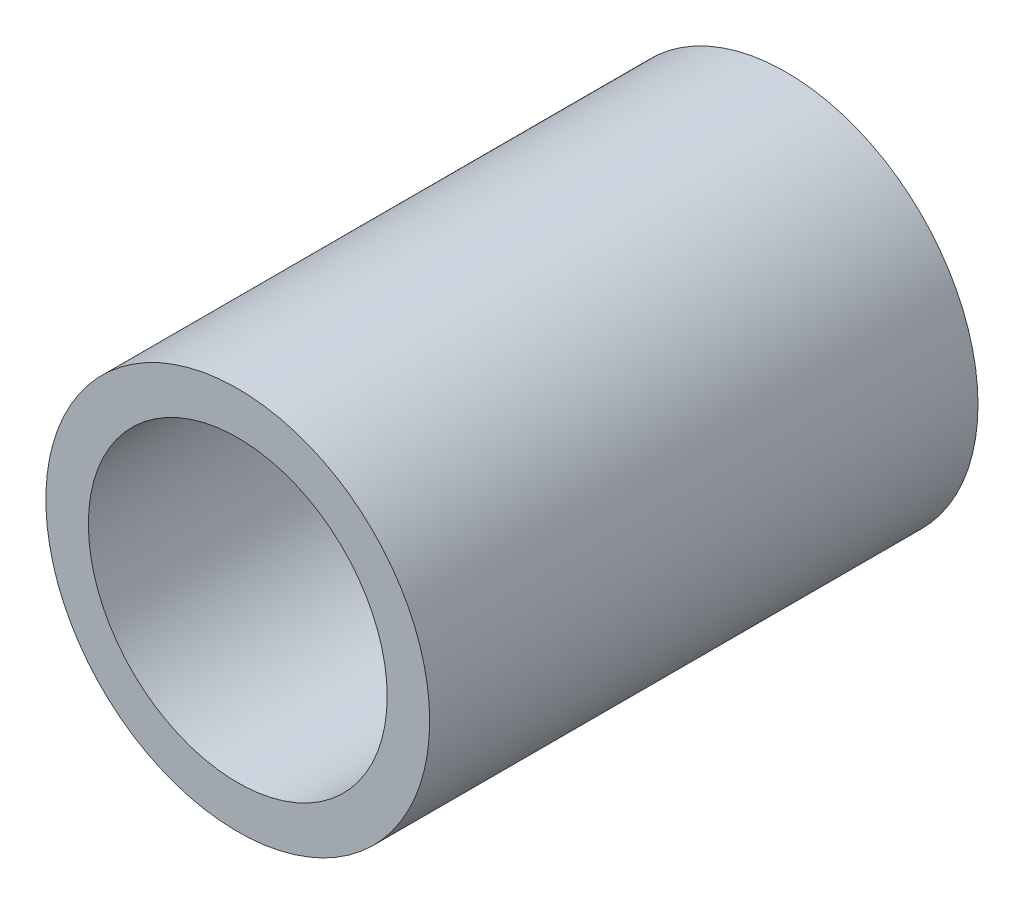
ISO-10303-21;
HEADER;
FILE_DESCRIPTION(('STEP AP214'),'2;1');
FILE_NAME('part.step','',(''),(''),'','','');
FILE_SCHEMA(('AUTOMOTIVE_DESIGN { 1 0 10303 214 1 1 1 1 }'));
ENDSEC;
DATA;
#1=APPLICATION_CONTEXT('core data for automotive mechanical design processes');
#2=APPLICATION_PROTOCOL_DEFINITION('international standard','automotive_design',2000,#1);
#3=PRODUCT_CONTEXT('',#1,'mechanical');
#4=PRODUCT('Part','Part','',(#3));
#5=PRODUCT_RELATED_PRODUCT_CATEGORY('part','',(#4));
#6=PRODUCT_DEFINITION_FORMATION('','',#4);
#7=PRODUCT_DEFINITION_CONTEXT('part definition',#1,'design');
#8=PRODUCT_DEFINITION('design','',#6,#7);
#9=PRODUCT_DEFINITION_SHAPE('','',#8);
#10=(LENGTH_UNIT() NAMED_UNIT(*) SI_UNIT(.MILLI.,.METRE.));
#11=(NAMED_UNIT(*) PLANE_ANGLE_UNIT() SI_UNIT($,.RADIAN.));
#12=(NAMED_UNIT(*) SI_UNIT($,.STERADIAN.) SOLID_ANGLE_UNIT());
#13=UNCERTAINTY_MEASURE_WITH_UNIT(LENGTH_MEASURE(1.E-05),#10,'distance_accuracy_value','');
#14=(GEOMETRIC_REPRESENTATION_CONTEXT(3) GLOBAL_UNCERTAINTY_ASSIGNED_CONTEXT((#13)) GLOBAL_UNIT_ASSIGNED_CONTEXT((#10,
#11,#12)) REPRESENTATION_CONTEXT('',''));
#15=CARTESIAN_POINT('',(0.,0.,0.));
#16=DIRECTION('',(0.,0.,1.));
#17=DIRECTION('',(1.,0.,0.));
#18=AXIS2_PLACEMENT_3D('',#15,#16,#17);
#19=CARTESIAN_POINT('',(0.,0.,10.));
#20=DIRECTION('',(0.,0.,1.));
#21=DIRECTION('',(1.,0.,0.));
#22=AXIS2_PLACEMENT_3D('',#19,#20,#21);
#23=PLANE('',#22);
#24=CARTESIAN_POINT('',(0.,0.,10.));
#25=DIRECTION('',(0.,0.,1.));
#26=DIRECTION('',(1.,0.,0.));
#27=AXIS2_PLACEMENT_3D('',#24,#25,#26);
#28=CIRCLE('',#27,3.5);
#29=CARTESIAN_POINT('',(3.5,0.,10.));
#30=VERTEX_POINT('',#29);
#31=EDGE_CURVE('E10',#30,#30,#28,.T.);
#32=ORIENTED_EDGE('',*,*,#31,.T.);
#33=EDGE_LOOP('',(#32));
#34=FACE_BOUND('',#33,.T.);
#35=CARTESIAN_POINT('',(0.,0.,10.));
#36=DIRECTION('',(0.,0.,1.));
#37=DIRECTION('',(1.,0.,0.));
#38=AXIS2_PLACEMENT_3D('',#35,#36,#37);
#39=CIRCLE('',#38,2.725);
#40=CARTESIAN_POINT('',(2.725,0.,10.));
#41=VERTEX_POINT('',#40);
#42=EDGE_CURVE('E41',#41,#41,#39,.T.);
#43=ORIENTED_EDGE('',*,*,#42,.F.);
#44=EDGE_LOOP('',(#43));
#45=FACE_BOUND('',#44,.T.);
#46=ADVANCED_FACE('F30',(#34,#45),#23,.T.);
#47=CARTESIAN_POINT('',(0.,0.,0.));
#48=DIRECTION('',(0.,0.,1.));
#49=DIRECTION('',(1.,0.,0.));
#50=AXIS2_PLACEMENT_3D('',#47,#48,#49);
#51=PLANE('',#50);
#52=CARTESIAN_POINT('',(0.,0.,0.));
#53=DIRECTION('',(0.,0.,1.));
#54=DIRECTION('',(1.,0.,0.));
#55=AXIS2_PLACEMENT_3D('',#52,#53,#54);
#56=CIRCLE('',#55,3.5);
#57=CARTESIAN_POINT('',(3.5,0.,0.));
#58=VERTEX_POINT('',#57);
#59=EDGE_CURVE('E34',#58,#58,#56,.T.);
#60=ORIENTED_EDGE('',*,*,#59,.F.);
#61=EDGE_LOOP('',(#60));
#62=FACE_BOUND('',#61,.T.);
#63=CARTESIAN_POINT('',(0.,0.,0.));
#64=DIRECTION('',(0.,0.,1.));
#65=DIRECTION('',(1.,0.,0.));
#66=AXIS2_PLACEMENT_3D('',#63,#64,#65);
#67=CIRCLE('',#66,2.725);
#68=CARTESIAN_POINT('',(2.725,0.,0.));
#69=VERTEX_POINT('',#68);
#70=EDGE_CURVE('E43',#69,#69,#67,.T.);
#71=ORIENTED_EDGE('',*,*,#70,.T.);
#72=EDGE_LOOP('',(#71));
#73=FACE_BOUND('',#72,.T.);
#74=ADVANCED_FACE('F53',(#62,#73),#51,.F.);
#75=CARTESIAN_POINT('',(0.,0.,10.));
#76=DIRECTION('',(0.,0.,-1.));
#77=DIRECTION('',(-1.,0.,0.));
#78=AXIS2_PLACEMENT_3D('',#75,#76,#77);
#79=CYLINDRICAL_SURFACE('',#78,3.5);
#80=ORIENTED_EDGE('',*,*,#31,.F.);
#81=EDGE_LOOP('',(#80));
#82=FACE_BOUND('',#81,.T.);
#83=ORIENTED_EDGE('',*,*,#59,.T.);
#84=EDGE_LOOP('',(#83));
#85=FACE_BOUND('',#84,.T.);
#86=ADVANCED_FACE('F32',(#82,#85),#79,.T.);
#87=CARTESIAN_POINT('',(0.,0.,10.));
#88=DIRECTION('',(0.,0.,-1.));
#89=DIRECTION('',(-1.,0.,0.));
#90=AXIS2_PLACEMENT_3D('',#87,#88,#89);
#91=CYLINDRICAL_SURFACE('',#90,2.725);
#92=ORIENTED_EDGE('',*,*,#42,.T.);
#93=EDGE_LOOP('',(#92));
#94=FACE_BOUND('',#93,.T.);
#95=ORIENTED_EDGE('',*,*,#70,.F.);
#96=EDGE_LOOP('',(#95));
#97=FACE_BOUND('',#96,.T.);
#98=ADVANCED_FACE('F49',(#94,#97),#91,.F.);
#99=CLOSED_SHELL('',(#46,#74,#86,#98));
#100=MANIFOLD_SOLID_BREP('B2',#99);
#101=ADVANCED_BREP_SHAPE_REPRESENTATION('',(#18,#100),#14);
#102=SHAPE_DEFINITION_REPRESENTATION(#9,#101);
ENDSEC;
END-ISO-10303-21;
